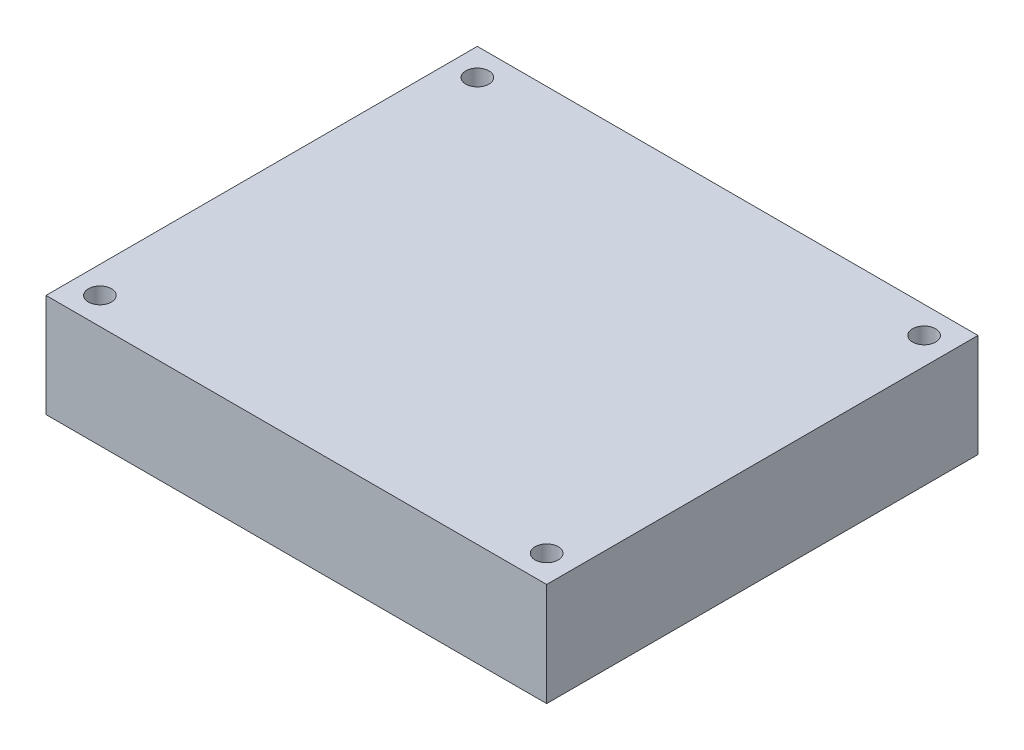
ISO-10303-21;
HEADER;
FILE_DESCRIPTION(('STEP AP214'),'2;1');
FILE_NAME('part.step','',(''),(''),'','','');
FILE_SCHEMA(('AUTOMOTIVE_DESIGN { 1 0 10303 214 1 1 1 1 }'));
ENDSEC;
DATA;
#1=APPLICATION_CONTEXT('core data for automotive mechanical design processes');
#2=APPLICATION_PROTOCOL_DEFINITION('international standard','automotive_design',2000,#1);
#3=PRODUCT_CONTEXT('',#1,'mechanical');
#4=PRODUCT('Part','Part','',(#3));
#5=PRODUCT_RELATED_PRODUCT_CATEGORY('part','',(#4));
#6=PRODUCT_DEFINITION_FORMATION('','',#4);
#7=PRODUCT_DEFINITION_CONTEXT('part definition',#1,'design');
#8=PRODUCT_DEFINITION('design','',#6,#7);
#9=PRODUCT_DEFINITION_SHAPE('','',#8);
#10=(LENGTH_UNIT() NAMED_UNIT(*) SI_UNIT(.MILLI.,.METRE.));
#11=(NAMED_UNIT(*) PLANE_ANGLE_UNIT() SI_UNIT($,.RADIAN.));
#12=(NAMED_UNIT(*) SI_UNIT($,.STERADIAN.) SOLID_ANGLE_UNIT());
#13=UNCERTAINTY_MEASURE_WITH_UNIT(LENGTH_MEASURE(1.E-05),#10,'distance_accuracy_value','');
#14=(GEOMETRIC_REPRESENTATION_CONTEXT(3) GLOBAL_UNCERTAINTY_ASSIGNED_CONTEXT((#13)) GLOBAL_UNIT_ASSIGNED_CONTEXT((#10,
#11,#12)) REPRESENTATION_CONTEXT('',''));
#15=CARTESIAN_POINT('',(0.,0.,0.));
#16=DIRECTION('',(0.,0.,1.));
#17=DIRECTION('',(1.,0.,0.));
#18=AXIS2_PLACEMENT_3D('',#15,#16,#17);
#19=CARTESIAN_POINT('',(32.5,-13.4,-28.));
#20=DIRECTION('',(1.,0.,0.));
#21=DIRECTION('',(0.,0.,-1.));
#22=AXIS2_PLACEMENT_3D('',#19,#20,#21);
#23=PLANE('',#22);
#24=DIRECTION('',(0.,0.,-1.));
#25=VECTOR('',#24,1.);
#26=CARTESIAN_POINT('',(32.5,0.,-28.));
#27=LINE('',#26,#25);
#28=CARTESIAN_POINT('',(32.5,0.,28.));
#29=VERTEX_POINT('',#28);
#30=CARTESIAN_POINT('',(32.5,0.,-28.));
#31=VERTEX_POINT('',#30);
#32=EDGE_CURVE('E100',#29,#31,#27,.T.);
#33=ORIENTED_EDGE('',*,*,#32,.F.);
#34=DIRECTION('',(0.,1.,0.));
#35=VECTOR('',#34,1.);
#36=CARTESIAN_POINT('',(32.5,-13.4,28.));
#37=LINE('',#36,#35);
#38=CARTESIAN_POINT('',(32.5,-13.4,28.));
#39=VERTEX_POINT('',#38);
#40=EDGE_CURVE('E11',#39,#29,#37,.T.);
#41=ORIENTED_EDGE('',*,*,#40,.F.);
#42=DIRECTION('',(0.,0.,-1.));
#43=VECTOR('',#42,1.);
#44=CARTESIAN_POINT('',(32.5,-13.4,-28.));
#45=LINE('',#44,#43);
#46=CARTESIAN_POINT('',(32.5,-13.4,-28.));
#47=VERTEX_POINT('',#46);
#48=EDGE_CURVE('E93',#39,#47,#45,.T.);
#49=ORIENTED_EDGE('',*,*,#48,.T.);
#50=DIRECTION('',(0.,1.,0.));
#51=VECTOR('',#50,1.);
#52=CARTESIAN_POINT('',(32.5,-13.4,-28.));
#53=LINE('',#52,#51);
#54=EDGE_CURVE('E38',#47,#31,#53,.T.);
#55=ORIENTED_EDGE('',*,*,#54,.T.);
#56=EDGE_LOOP('',(#33,#41,#49,#55));
#57=FACE_BOUND('',#56,.T.);
#58=ADVANCED_FACE('F35',(#57),#23,.T.);
#59=CARTESIAN_POINT('',(-32.5,-13.4,28.));
#60=DIRECTION('',(0.,0.,1.));
#61=DIRECTION('',(1.,0.,0.));
#62=AXIS2_PLACEMENT_3D('',#59,#60,#61);
#63=PLANE('',#62);
#64=DIRECTION('',(1.,0.,0.));
#65=VECTOR('',#64,1.);
#66=CARTESIAN_POINT('',(-32.5,0.,28.));
#67=LINE('',#66,#65);
#68=CARTESIAN_POINT('',(-32.5,0.,28.));
#69=VERTEX_POINT('',#68);
#70=EDGE_CURVE('E95',#69,#29,#67,.T.);
#71=ORIENTED_EDGE('',*,*,#70,.F.);
#72=DIRECTION('',(0.,1.,0.));
#73=VECTOR('',#72,1.);
#74=CARTESIAN_POINT('',(-32.5,-13.4,28.));
#75=LINE('',#74,#73);
#76=CARTESIAN_POINT('',(-32.5,-13.4,28.));
#77=VERTEX_POINT('',#76);
#78=EDGE_CURVE('E44',#77,#69,#75,.T.);
#79=ORIENTED_EDGE('',*,*,#78,.F.);
#80=DIRECTION('',(1.,0.,0.));
#81=VECTOR('',#80,1.);
#82=CARTESIAN_POINT('',(-32.5,-13.4,28.));
#83=LINE('',#82,#81);
#84=EDGE_CURVE('E90',#77,#39,#83,.T.);
#85=ORIENTED_EDGE('',*,*,#84,.T.);
#86=ORIENTED_EDGE('',*,*,#40,.T.);
#87=EDGE_LOOP('',(#71,#79,#85,#86));
#88=FACE_BOUND('',#87,.T.);
#89=ADVANCED_FACE('F111',(#88),#63,.T.);
#90=CARTESIAN_POINT('',(-32.5,-13.4,-28.));
#91=DIRECTION('',(-1.,0.,0.));
#92=DIRECTION('',(0.,0.,1.));
#93=AXIS2_PLACEMENT_3D('',#90,#91,#92);
#94=PLANE('',#93);
#95=DIRECTION('',(0.,0.,1.));
#96=VECTOR('',#95,1.);
#97=CARTESIAN_POINT('',(-32.5,0.,-28.));
#98=LINE('',#97,#96);
#99=CARTESIAN_POINT('',(-32.5,0.,-28.));
#100=VERTEX_POINT('',#99);
#101=EDGE_CURVE('E85',#100,#69,#98,.T.);
#102=ORIENTED_EDGE('',*,*,#101,.F.);
#103=DIRECTION('',(0.,1.,0.));
#104=VECTOR('',#103,1.);
#105=CARTESIAN_POINT('',(-32.5,-13.4,-28.));
#106=LINE('',#105,#104);
#107=CARTESIAN_POINT('',(-32.5,-13.4,-28.));
#108=VERTEX_POINT('',#107);
#109=EDGE_CURVE('E80',#108,#100,#106,.T.);
#110=ORIENTED_EDGE('',*,*,#109,.F.);
#111=DIRECTION('',(0.,0.,1.));
#112=VECTOR('',#111,1.);
#113=CARTESIAN_POINT('',(-32.5,-13.4,-28.));
#114=LINE('',#113,#112);
#115=EDGE_CURVE('E83',#108,#77,#114,.T.);
#116=ORIENTED_EDGE('',*,*,#115,.T.);
#117=ORIENTED_EDGE('',*,*,#78,.T.);
#118=EDGE_LOOP('',(#102,#110,#116,#117));
#119=FACE_BOUND('',#118,.T.);
#120=ADVANCED_FACE('F82',(#119),#94,.T.);
#121=CARTESIAN_POINT('',(-32.5,-13.4,-28.));
#122=DIRECTION('',(0.,0.,-1.));
#123=DIRECTION('',(-1.,0.,0.));
#124=AXIS2_PLACEMENT_3D('',#121,#122,#123);
#125=PLANE('',#124);
#126=DIRECTION('',(-1.,0.,0.));
#127=VECTOR('',#126,1.);
#128=CARTESIAN_POINT('',(-32.5,0.,-28.));
#129=LINE('',#128,#127);
#130=EDGE_CURVE('E103',#31,#100,#129,.T.);
#131=ORIENTED_EDGE('',*,*,#130,.F.);
#132=ORIENTED_EDGE('',*,*,#54,.F.);
#133=DIRECTION('',(-1.,0.,0.));
#134=VECTOR('',#133,1.);
#135=CARTESIAN_POINT('',(-32.5,-13.4,-28.));
#136=LINE('',#135,#134);
#137=EDGE_CURVE('E89',#47,#108,#136,.T.);
#138=ORIENTED_EDGE('',*,*,#137,.T.);
#139=ORIENTED_EDGE('',*,*,#109,.T.);
#140=EDGE_LOOP('',(#131,#132,#138,#139));
#141=FACE_BOUND('',#140,.T.);
#142=ADVANCED_FACE('F92',(#141),#125,.T.);
#143=CARTESIAN_POINT('',(0.,-13.4,0.));
#144=DIRECTION('',(0.,1.,0.));
#145=DIRECTION('',(0.,0.,1.));
#146=AXIS2_PLACEMENT_3D('',#143,#144,#145);
#147=PLANE('',#146);
#148=CARTESIAN_POINT('',(29.,-13.4,24.5));
#149=DIRECTION('',(0.,1.,0.));
#150=DIRECTION('',(0.,0.,1.));
#151=AXIS2_PLACEMENT_3D('',#148,#149,#150);
#152=CIRCLE('',#151,1.5);
#153=CARTESIAN_POINT('',(29.,-13.4,26.));
#154=VERTEX_POINT('',#153);
#155=EDGE_CURVE('E168',#154,#154,#152,.F.);
#156=ORIENTED_EDGE('',*,*,#155,.F.);
#157=EDGE_LOOP('',(#156));
#158=FACE_BOUND('',#157,.T.);
#159=CARTESIAN_POINT('',(-29.,-13.4,-24.5));
#160=DIRECTION('',(0.,1.,0.));
#161=DIRECTION('',(0.,0.,1.));
#162=AXIS2_PLACEMENT_3D('',#159,#160,#161);
#163=CIRCLE('',#162,1.5);
#164=CARTESIAN_POINT('',(-29.,-13.4,-23.));
#165=VERTEX_POINT('',#164);
#166=EDGE_CURVE('E161',#165,#165,#163,.F.);
#167=ORIENTED_EDGE('',*,*,#166,.F.);
#168=EDGE_LOOP('',(#167));
#169=FACE_BOUND('',#168,.T.);
#170=CARTESIAN_POINT('',(-29.,-13.4,24.5));
#171=DIRECTION('',(0.,1.,0.));
#172=DIRECTION('',(0.,0.,1.));
#173=AXIS2_PLACEMENT_3D('',#170,#171,#172);
#174=CIRCLE('',#173,1.5);
#175=CARTESIAN_POINT('',(-29.,-13.4,26.));
#176=VERTEX_POINT('',#175);
#177=EDGE_CURVE('E156',#176,#176,#174,.F.);
#178=ORIENTED_EDGE('',*,*,#177,.F.);
#179=EDGE_LOOP('',(#178));
#180=FACE_BOUND('',#179,.T.);
#181=CARTESIAN_POINT('',(29.,-13.4,-24.5));
#182=DIRECTION('',(0.,1.,0.));
#183=DIRECTION('',(0.,0.,1.));
#184=AXIS2_PLACEMENT_3D('',#181,#182,#183);
#185=CIRCLE('',#184,1.5);
#186=CARTESIAN_POINT('',(29.,-13.4,-23.));
#187=VERTEX_POINT('',#186);
#188=EDGE_CURVE('E104',#187,#187,#185,.F.);
#189=ORIENTED_EDGE('',*,*,#188,.F.);
#190=EDGE_LOOP('',(#189));
#191=FACE_BOUND('',#190,.T.);
#192=ORIENTED_EDGE('',*,*,#48,.F.);
#193=ORIENTED_EDGE('',*,*,#84,.F.);
#194=ORIENTED_EDGE('',*,*,#115,.F.);
#195=ORIENTED_EDGE('',*,*,#137,.F.);
#196=EDGE_LOOP('',(#192,#193,#194,#195));
#197=FACE_BOUND('',#196,.T.);
#198=ADVANCED_FACE('F88',(#158,#169,#180,#191,#197),#147,.F.);
#199=CARTESIAN_POINT('',(0.,0.,0.));
#200=DIRECTION('',(0.,1.,0.));
#201=DIRECTION('',(0.,0.,1.));
#202=AXIS2_PLACEMENT_3D('',#199,#200,#201);
#203=PLANE('',#202);
#204=CARTESIAN_POINT('',(29.,0.,24.5));
#205=DIRECTION('',(0.,1.,0.));
#206=DIRECTION('',(0.,0.,1.));
#207=AXIS2_PLACEMENT_3D('',#204,#205,#206);
#208=CIRCLE('',#207,1.5);
#209=CARTESIAN_POINT('',(29.,0.,26.));
#210=VERTEX_POINT('',#209);
#211=EDGE_CURVE('E165',#210,#210,#208,.T.);
#212=ORIENTED_EDGE('',*,*,#211,.F.);
#213=EDGE_LOOP('',(#212));
#214=FACE_BOUND('',#213,.T.);
#215=CARTESIAN_POINT('',(-29.,0.,-24.5));
#216=DIRECTION('',(0.,1.,0.));
#217=DIRECTION('',(0.,0.,1.));
#218=AXIS2_PLACEMENT_3D('',#215,#216,#217);
#219=CIRCLE('',#218,1.5);
#220=CARTESIAN_POINT('',(-29.,0.,-23.));
#221=VERTEX_POINT('',#220);
#222=EDGE_CURVE('E158',#221,#221,#219,.T.);
#223=ORIENTED_EDGE('',*,*,#222,.F.);
#224=EDGE_LOOP('',(#223));
#225=FACE_BOUND('',#224,.T.);
#226=CARTESIAN_POINT('',(-29.,0.,24.5));
#227=DIRECTION('',(0.,1.,0.));
#228=DIRECTION('',(0.,0.,1.));
#229=AXIS2_PLACEMENT_3D('',#226,#227,#228);
#230=CIRCLE('',#229,1.5);
#231=CARTESIAN_POINT('',(-29.,0.,26.));
#232=VERTEX_POINT('',#231);
#233=EDGE_CURVE('E153',#232,#232,#230,.T.);
#234=ORIENTED_EDGE('',*,*,#233,.F.);
#235=EDGE_LOOP('',(#234));
#236=FACE_BOUND('',#235,.T.);
#237=CARTESIAN_POINT('',(29.,0.,-24.5));
#238=DIRECTION('',(0.,1.,0.));
#239=DIRECTION('',(0.,0.,1.));
#240=AXIS2_PLACEMENT_3D('',#237,#238,#239);
#241=CIRCLE('',#240,1.5);
#242=CARTESIAN_POINT('',(29.,0.,-23.));
#243=VERTEX_POINT('',#242);
#244=EDGE_CURVE('E170',#243,#243,#241,.T.);
#245=ORIENTED_EDGE('',*,*,#244,.F.);
#246=EDGE_LOOP('',(#245));
#247=FACE_BOUND('',#246,.T.);
#248=ORIENTED_EDGE('',*,*,#32,.T.);
#249=ORIENTED_EDGE('',*,*,#130,.T.);
#250=ORIENTED_EDGE('',*,*,#101,.T.);
#251=ORIENTED_EDGE('',*,*,#70,.T.);
#252=EDGE_LOOP('',(#248,#249,#250,#251));
#253=FACE_BOUND('',#252,.T.);
#254=ADVANCED_FACE('F110',(#214,#225,#236,#247,#253),#203,.T.);
#255=CARTESIAN_POINT('',(29.,-13.401,-24.5));
#256=DIRECTION('',(0.,1.,0.));
#257=DIRECTION('',(0.,0.,1.));
#258=AXIS2_PLACEMENT_3D('',#255,#256,#257);
#259=CYLINDRICAL_SURFACE('',#258,1.5);
#260=ORIENTED_EDGE('',*,*,#244,.T.);
#261=EDGE_LOOP('',(#260));
#262=FACE_BOUND('',#261,.T.);
#263=ORIENTED_EDGE('',*,*,#188,.T.);
#264=EDGE_LOOP('',(#263));
#265=FACE_BOUND('',#264,.T.);
#266=ADVANCED_FACE('F129',(#262,#265),#259,.F.);
#267=CARTESIAN_POINT('',(-29.,-13.401,24.5));
#268=DIRECTION('',(0.,1.,0.));
#269=DIRECTION('',(0.,0.,1.));
#270=AXIS2_PLACEMENT_3D('',#267,#268,#269);
#271=CYLINDRICAL_SURFACE('',#270,1.5);
#272=ORIENTED_EDGE('',*,*,#233,.T.);
#273=EDGE_LOOP('',(#272));
#274=FACE_BOUND('',#273,.T.);
#275=ORIENTED_EDGE('',*,*,#177,.T.);
#276=EDGE_LOOP('',(#275));
#277=FACE_BOUND('',#276,.T.);
#278=ADVANCED_FACE('F136',(#274,#277),#271,.F.);
#279=CARTESIAN_POINT('',(-29.,-13.401,-24.5));
#280=DIRECTION('',(0.,1.,0.));
#281=DIRECTION('',(0.,0.,1.));
#282=AXIS2_PLACEMENT_3D('',#279,#280,#281);
#283=CYLINDRICAL_SURFACE('',#282,1.5);
#284=ORIENTED_EDGE('',*,*,#222,.T.);
#285=EDGE_LOOP('',(#284));
#286=FACE_BOUND('',#285,.T.);
#287=ORIENTED_EDGE('',*,*,#166,.T.);
#288=EDGE_LOOP('',(#287));
#289=FACE_BOUND('',#288,.T.);
#290=ADVANCED_FACE('F138',(#286,#289),#283,.F.);
#291=CARTESIAN_POINT('',(29.,-13.401,24.5));
#292=DIRECTION('',(0.,1.,0.));
#293=DIRECTION('',(0.,0.,1.));
#294=AXIS2_PLACEMENT_3D('',#291,#292,#293);
#295=CYLINDRICAL_SURFACE('',#294,1.5);
#296=ORIENTED_EDGE('',*,*,#211,.T.);
#297=EDGE_LOOP('',(#296));
#298=FACE_BOUND('',#297,.T.);
#299=ORIENTED_EDGE('',*,*,#155,.T.);
#300=EDGE_LOOP('',(#299));
#301=FACE_BOUND('',#300,.T.);
#302=ADVANCED_FACE('F141',(#298,#301),#295,.F.);
#303=CLOSED_SHELL('',(#58,#89,#120,#142,#198,#254,#266,#278,#290,#302));
#304=MANIFOLD_SOLID_BREP('B2',#303);
#305=ADVANCED_BREP_SHAPE_REPRESENTATION('',(#18,#304),#14);
#306=SHAPE_DEFINITION_REPRESENTATION(#9,#305);
ENDSEC;
END-ISO-10303-21;
